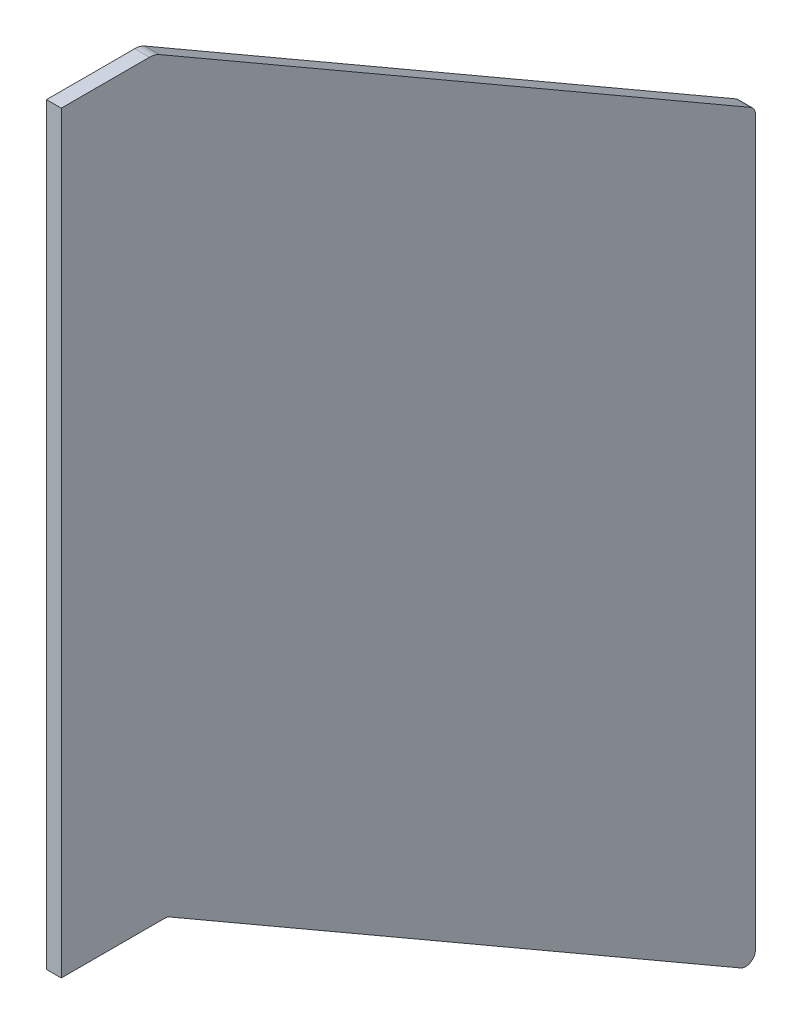
ISO-10303-21;
HEADER;
FILE_DESCRIPTION(('STEP AP214'),'2;1');
FILE_NAME('part.step','',(''),(''),'','','');
FILE_SCHEMA(('AUTOMOTIVE_DESIGN { 1 0 10303 214 1 1 1 1 }'));
ENDSEC;
DATA;
#1=APPLICATION_CONTEXT('core data for automotive mechanical design processes');
#2=APPLICATION_PROTOCOL_DEFINITION('international standard','automotive_design',2000,#1);
#3=PRODUCT_CONTEXT('',#1,'mechanical');
#4=PRODUCT('Part','Part','',(#3));
#5=PRODUCT_RELATED_PRODUCT_CATEGORY('part','',(#4));
#6=PRODUCT_DEFINITION_FORMATION('','',#4);
#7=PRODUCT_DEFINITION_CONTEXT('part definition',#1,'design');
#8=PRODUCT_DEFINITION('design','',#6,#7);
#9=PRODUCT_DEFINITION_SHAPE('','',#8);
#10=(LENGTH_UNIT() NAMED_UNIT(*) SI_UNIT(.MILLI.,.METRE.));
#11=(NAMED_UNIT(*) PLANE_ANGLE_UNIT() SI_UNIT($,.RADIAN.));
#12=(NAMED_UNIT(*) SI_UNIT($,.STERADIAN.) SOLID_ANGLE_UNIT());
#13=UNCERTAINTY_MEASURE_WITH_UNIT(LENGTH_MEASURE(1.E-05),#10,'distance_accuracy_value','');
#14=(GEOMETRIC_REPRESENTATION_CONTEXT(3) GLOBAL_UNCERTAINTY_ASSIGNED_CONTEXT((#13)) GLOBAL_UNIT_ASSIGNED_CONTEXT((#10,
#11,#12)) REPRESENTATION_CONTEXT('',''));
#15=CARTESIAN_POINT('',(0.,0.,0.));
#16=DIRECTION('',(0.,0.,1.));
#17=DIRECTION('',(1.,0.,0.));
#18=AXIS2_PLACEMENT_3D('',#15,#16,#17);
#19=CARTESIAN_POINT('',(-1.5,76.5,0.));
#20=DIRECTION('',(0.,0.,1.));
#21=DIRECTION('',(0.,-1.,0.));
#22=AXIS2_PLACEMENT_3D('',#19,#20,#21);
#23=PLANE('',#22);
#24=DIRECTION('',(0.,-1.,0.));
#25=VECTOR('',#24,1.);
#26=CARTESIAN_POINT('',(0.,76.5,0.));
#27=LINE('',#26,#25);
#28=CARTESIAN_POINT('',(0.,76.5,0.));
#29=VERTEX_POINT('',#28);
#30=CARTESIAN_POINT('',(0.,0.,0.));
#31=VERTEX_POINT('',#30);
#32=EDGE_CURVE('E147',#29,#31,#27,.T.);
#33=ORIENTED_EDGE('',*,*,#32,.F.);
#34=DIRECTION('',(1.,0.,0.));
#35=VECTOR('',#34,1.);
#36=CARTESIAN_POINT('',(-1.5,76.5,0.));
#37=LINE('',#36,#35);
#38=CARTESIAN_POINT('',(-1.5,76.5,0.));
#39=VERTEX_POINT('',#38);
#40=EDGE_CURVE('E11',#39,#29,#37,.T.);
#41=ORIENTED_EDGE('',*,*,#40,.F.);
#42=DIRECTION('',(0.,-1.,0.));
#43=VECTOR('',#42,1.);
#44=CARTESIAN_POINT('',(-1.5,76.5,0.));
#45=LINE('',#44,#43);
#46=CARTESIAN_POINT('',(-1.5,0.,0.));
#47=VERTEX_POINT('',#46);
#48=EDGE_CURVE('E173',#39,#47,#45,.T.);
#49=ORIENTED_EDGE('',*,*,#48,.T.);
#50=DIRECTION('',(1.,0.,0.));
#51=VECTOR('',#50,1.);
#52=CARTESIAN_POINT('',(-1.5,0.,0.));
#53=LINE('',#52,#51);
#54=EDGE_CURVE('E41',#47,#31,#53,.T.);
#55=ORIENTED_EDGE('',*,*,#54,.T.);
#56=EDGE_LOOP('',(#33,#41,#49,#55));
#57=FACE_BOUND('',#56,.T.);
#58=ADVANCED_FACE('F38',(#57),#23,.T.);
#59=CARTESIAN_POINT('',(-1.5,76.5,-8.96410161513773));
#60=DIRECTION('',(0.,1.,0.));
#61=DIRECTION('',(0.,0.,1.));
#62=AXIS2_PLACEMENT_3D('',#59,#60,#61);
#63=PLANE('',#62);
#64=DIRECTION('',(0.,0.,1.));
#65=VECTOR('',#64,1.);
#66=CARTESIAN_POINT('',(0.,76.5,-8.96410161513773));
#67=LINE('',#66,#65);
#68=CARTESIAN_POINT('',(0.,76.5,-8.96410161513773));
#69=VERTEX_POINT('',#68);
#70=EDGE_CURVE('E171',#69,#29,#67,.T.);
#71=ORIENTED_EDGE('',*,*,#70,.F.);
#72=DIRECTION('',(1.,0.,0.));
#73=VECTOR('',#72,1.);
#74=CARTESIAN_POINT('',(-1.5,76.5,-8.96410161513773));
#75=LINE('',#74,#73);
#76=CARTESIAN_POINT('',(-1.5,76.5,-8.96410161513773));
#77=VERTEX_POINT('',#76);
#78=EDGE_CURVE('E47',#77,#69,#75,.T.);
#79=ORIENTED_EDGE('',*,*,#78,.F.);
#80=DIRECTION('',(0.,0.,1.));
#81=VECTOR('',#80,1.);
#82=CARTESIAN_POINT('',(-1.5,76.5,-8.96410161513773));
#83=LINE('',#82,#81);
#84=EDGE_CURVE('E137',#77,#39,#83,.T.);
#85=ORIENTED_EDGE('',*,*,#84,.T.);
#86=ORIENTED_EDGE('',*,*,#40,.T.);
#87=EDGE_LOOP('',(#71,#79,#85,#86));
#88=FACE_BOUND('',#87,.T.);
#89=ADVANCED_FACE('F189',(#88),#63,.T.);
#90=CARTESIAN_POINT('',(-1.5,74.5,-8.96410161513773));
#91=DIRECTION('',(1.,0.,0.));
#92=DIRECTION('',(0.,0.,-1.));
#93=AXIS2_PLACEMENT_3D('',#90,#91,#92);
#94=CYLINDRICAL_SURFACE('',#93,2.00000000000001);
#95=CARTESIAN_POINT('',(0.,74.5,-8.96410161513773));
#96=DIRECTION('',(1.,0.,0.));
#97=DIRECTION('',(0.,0.,-1.));
#98=AXIS2_PLACEMENT_3D('',#95,#96,#97);
#99=CIRCLE('',#98,2.00000000000001);
#100=CARTESIAN_POINT('',(0.,76.2320508075689,-9.96410161513773));
#101=VERTEX_POINT('',#100);
#102=EDGE_CURVE('E124',#101,#69,#99,.T.);
#103=ORIENTED_EDGE('',*,*,#102,.F.);
#104=DIRECTION('',(1.,0.,0.));
#105=VECTOR('',#104,1.);
#106=CARTESIAN_POINT('',(-1.5,76.2320508075689,-9.96410161513773));
#107=LINE('',#106,#105);
#108=CARTESIAN_POINT('',(-1.5,76.2320508075689,-9.96410161513773));
#109=VERTEX_POINT('',#108);
#110=EDGE_CURVE('E119',#109,#101,#107,.T.);
#111=ORIENTED_EDGE('',*,*,#110,.F.);
#112=CARTESIAN_POINT('',(-1.5,74.5,-8.96410161513773));
#113=DIRECTION('',(1.,0.,0.));
#114=DIRECTION('',(0.,0.,-1.));
#115=AXIS2_PLACEMENT_3D('',#112,#113,#114);
#116=CIRCLE('',#115,2.00000000000001);
#117=EDGE_CURVE('E122',#109,#77,#116,.T.);
#118=ORIENTED_EDGE('',*,*,#117,.T.);
#119=ORIENTED_EDGE('',*,*,#78,.T.);
#120=EDGE_LOOP('',(#103,#111,#118,#119));
#121=FACE_BOUND('',#120,.T.);
#122=ADVANCED_FACE('F121',(#121),#94,.T.);
#123=CARTESIAN_POINT('',(-1.5,41.5703087140275,-70.));
#124=DIRECTION('',(0.,0.866025403784438,-0.500000000000001));
#125=DIRECTION('',(0.,0.500000000000001,0.866025403784438));
#126=AXIS2_PLACEMENT_3D('',#123,#124,#125);
#127=PLANE('',#126);
#128=DIRECTION('',(0.,0.500000000000001,0.866025403784438));
#129=VECTOR('',#128,1.);
#130=CARTESIAN_POINT('',(0.,41.5703087140275,-70.));
#131=LINE('',#130,#129);
#132=CARTESIAN_POINT('',(0.,41.5703087140275,-70.));
#133=VERTEX_POINT('',#132);
#134=EDGE_CURVE('E168',#133,#101,#131,.T.);
#135=ORIENTED_EDGE('',*,*,#134,.F.);
#136=DIRECTION('',(1.,0.,0.));
#137=VECTOR('',#136,1.);
#138=CARTESIAN_POINT('',(-1.5,41.5703087140275,-70.));
#139=LINE('',#138,#137);
#140=CARTESIAN_POINT('',(-1.5,41.5703087140275,-70.));
#141=VERTEX_POINT('',#140);
#142=EDGE_CURVE('E129',#141,#133,#139,.T.);
#143=ORIENTED_EDGE('',*,*,#142,.F.);
#144=DIRECTION('',(0.,0.500000000000001,0.866025403784438));
#145=VECTOR('',#144,1.);
#146=CARTESIAN_POINT('',(-1.5,41.5703087140275,-70.));
#147=LINE('',#146,#145);
#148=EDGE_CURVE('E135',#141,#109,#147,.T.);
#149=ORIENTED_EDGE('',*,*,#148,.T.);
#150=ORIENTED_EDGE('',*,*,#110,.T.);
#151=EDGE_LOOP('',(#135,#143,#149,#150));
#152=FACE_BOUND('',#151,.T.);
#153=ADVANCED_FACE('F139',(#152),#127,.T.);
#154=CARTESIAN_POINT('',(-1.5,40.7042833102431,-69.5));
#155=DIRECTION('',(1.,0.,0.));
#156=DIRECTION('',(0.,0.,-1.));
#157=AXIS2_PLACEMENT_3D('',#154,#155,#156);
#158=CYLINDRICAL_SURFACE('',#157,1.00000000000001);
#159=CARTESIAN_POINT('',(0.,40.7042833102431,-69.5));
#160=DIRECTION('',(1.,0.,0.));
#161=DIRECTION('',(0.,0.,-1.));
#162=AXIS2_PLACEMENT_3D('',#159,#160,#161);
#163=CIRCLE('',#162,1.00000000000001);
#164=CARTESIAN_POINT('',(0.,40.7042833102431,-70.5));
#165=VERTEX_POINT('',#164);
#166=EDGE_CURVE('E165',#165,#133,#163,.T.);
#167=ORIENTED_EDGE('',*,*,#166,.F.);
#168=DIRECTION('',(1.,0.,0.));
#169=VECTOR('',#168,1.);
#170=CARTESIAN_POINT('',(-1.5,40.7042833102431,-70.5));
#171=LINE('',#170,#169);
#172=CARTESIAN_POINT('',(-1.5,40.7042833102431,-70.5));
#173=VERTEX_POINT('',#172);
#174=EDGE_CURVE('E177',#173,#165,#171,.T.);
#175=ORIENTED_EDGE('',*,*,#174,.F.);
#176=CARTESIAN_POINT('',(-1.5,40.7042833102431,-69.5));
#177=DIRECTION('',(1.,0.,0.));
#178=DIRECTION('',(0.,0.,-1.));
#179=AXIS2_PLACEMENT_3D('',#176,#177,#178);
#180=CIRCLE('',#179,1.00000000000001);
#181=EDGE_CURVE('E140',#173,#141,#180,.T.);
#182=ORIENTED_EDGE('',*,*,#181,.T.);
#183=ORIENTED_EDGE('',*,*,#142,.T.);
#184=EDGE_LOOP('',(#167,#175,#182,#183));
#185=FACE_BOUND('',#184,.T.);
#186=ADVANCED_FACE('F202',(#185),#158,.T.);
#187=CARTESIAN_POINT('',(-1.5,-32.7542648054295,-70.5));
#188=DIRECTION('',(0.,0.,-1.));
#189=DIRECTION('',(-1.,0.,0.));
#190=AXIS2_PLACEMENT_3D('',#187,#188,#189);
#191=PLANE('',#190);
#192=DIRECTION('',(0.,1.,0.));
#193=VECTOR('',#192,1.);
#194=CARTESIAN_POINT('',(0.,-32.7542648054295,-70.5));
#195=LINE('',#194,#193);
#196=CARTESIAN_POINT('',(0.,-32.7542648054295,-70.5));
#197=VERTEX_POINT('',#196);
#198=EDGE_CURVE('E162',#197,#165,#195,.T.);
#199=ORIENTED_EDGE('',*,*,#198,.F.);
#200=DIRECTION('',(1.,0.,0.));
#201=VECTOR('',#200,1.);
#202=CARTESIAN_POINT('',(-1.5,-32.7542648054295,-70.5));
#203=LINE('',#202,#201);
#204=CARTESIAN_POINT('',(-1.5,-32.7542648054295,-70.5));
#205=VERTEX_POINT('',#204);
#206=EDGE_CURVE('E179',#205,#197,#203,.T.);
#207=ORIENTED_EDGE('',*,*,#206,.F.);
#208=DIRECTION('',(0.,1.,0.));
#209=VECTOR('',#208,1.);
#210=CARTESIAN_POINT('',(-1.5,-32.7542648054295,-70.5));
#211=LINE('',#210,#209);
#212=EDGE_CURVE('E142',#205,#173,#211,.T.);
#213=ORIENTED_EDGE('',*,*,#212,.T.);
#214=ORIENTED_EDGE('',*,*,#174,.T.);
#215=EDGE_LOOP('',(#199,#207,#213,#214));
#216=FACE_BOUND('',#215,.T.);
#217=ADVANCED_FACE('F205',(#216),#191,.T.);
#218=CARTESIAN_POINT('',(-1.5,-32.7542648054295,-69.5));
#219=DIRECTION('',(1.,0.,0.));
#220=DIRECTION('',(0.,0.,-1.));
#221=AXIS2_PLACEMENT_3D('',#218,#219,#220);
#222=CYLINDRICAL_SURFACE('',#221,1.);
#223=CARTESIAN_POINT('',(0.,-32.7542648054295,-69.5));
#224=DIRECTION('',(1.,0.,0.));
#225=DIRECTION('',(0.,0.,-1.));
#226=AXIS2_PLACEMENT_3D('',#223,#224,#225);
#227=CIRCLE('',#226,1.);
#228=CARTESIAN_POINT('',(0.,-33.6202902092139,-69.));
#229=VERTEX_POINT('',#228);
#230=EDGE_CURVE('E159',#229,#197,#227,.T.);
#231=ORIENTED_EDGE('',*,*,#230,.F.);
#232=DIRECTION('',(1.,0.,0.));
#233=VECTOR('',#232,1.);
#234=CARTESIAN_POINT('',(-1.5,-33.6202902092139,-69.));
#235=LINE('',#234,#233);
#236=CARTESIAN_POINT('',(-1.5,-33.6202902092139,-69.));
#237=VERTEX_POINT('',#236);
#238=EDGE_CURVE('E181',#237,#229,#235,.T.);
#239=ORIENTED_EDGE('',*,*,#238,.F.);
#240=CARTESIAN_POINT('',(-1.5,-32.7542648054295,-69.5));
#241=DIRECTION('',(1.,0.,0.));
#242=DIRECTION('',(0.,0.,-1.));
#243=AXIS2_PLACEMENT_3D('',#240,#241,#242);
#244=CIRCLE('',#243,1.);
#245=EDGE_CURVE('E328',#237,#205,#244,.T.);
#246=ORIENTED_EDGE('',*,*,#245,.T.);
#247=ORIENTED_EDGE('',*,*,#206,.T.);
#248=EDGE_LOOP('',(#231,#239,#246,#247));
#249=FACE_BOUND('',#248,.T.);
#250=ADVANCED_FACE('F209',(#249),#222,.T.);
#251=CARTESIAN_POINT('',(-1.5,-0.133974596215561,-11.));
#252=DIRECTION('',(0.,-0.866025403784438,0.500000000000001));
#253=DIRECTION('',(0.,-0.500000000000001,-0.866025403784438));
#254=AXIS2_PLACEMENT_3D('',#251,#252,#253);
#255=PLANE('',#254);
#256=DIRECTION('',(0.,-0.500000000000001,-0.866025403784438));
#257=VECTOR('',#256,1.);
#258=CARTESIAN_POINT('',(0.,-0.133974596215561,-11.));
#259=LINE('',#258,#257);
#260=CARTESIAN_POINT('',(0.,-0.133974596215562,-11.));
#261=VERTEX_POINT('',#260);
#262=EDGE_CURVE('E156',#261,#229,#259,.T.);
#263=ORIENTED_EDGE('',*,*,#262,.F.);
#264=DIRECTION('',(1.,0.,0.));
#265=VECTOR('',#264,1.);
#266=CARTESIAN_POINT('',(-1.5,-0.133974596215562,-11.));
#267=LINE('',#266,#265);
#268=CARTESIAN_POINT('',(-1.5,-0.133974596215562,-11.));
#269=VERTEX_POINT('',#268);
#270=EDGE_CURVE('E183',#269,#261,#267,.T.);
#271=ORIENTED_EDGE('',*,*,#270,.F.);
#272=DIRECTION('',(0.,-0.500000000000001,-0.866025403784438));
#273=VECTOR('',#272,1.);
#274=CARTESIAN_POINT('',(-1.5,-0.133974596215561,-11.));
#275=LINE('',#274,#273);
#276=EDGE_CURVE('E324',#269,#237,#275,.T.);
#277=ORIENTED_EDGE('',*,*,#276,.T.);
#278=ORIENTED_EDGE('',*,*,#238,.T.);
#279=EDGE_LOOP('',(#263,#271,#277,#278));
#280=FACE_BOUND('',#279,.T.);
#281=ADVANCED_FACE('F213',(#280),#255,.T.);
#282=CARTESIAN_POINT('',(-1.5,-1.,-10.5));
#283=DIRECTION('',(1.,0.,0.));
#284=DIRECTION('',(0.,0.,-1.));
#285=AXIS2_PLACEMENT_3D('',#282,#283,#284);
#286=CYLINDRICAL_SURFACE('',#285,1.);
#287=CARTESIAN_POINT('',(0.,-1.,-10.5));
#288=DIRECTION('',(-1.,0.,0.));
#289=DIRECTION('',(0.,0.,-1.));
#290=AXIS2_PLACEMENT_3D('',#287,#288,#289);
#291=CIRCLE('',#290,1.);
#292=CARTESIAN_POINT('',(0.,0.,-10.5));
#293=VERTEX_POINT('',#292);
#294=EDGE_CURVE('E153',#293,#261,#291,.T.);
#295=ORIENTED_EDGE('',*,*,#294,.F.);
#296=DIRECTION('',(1.,0.,0.));
#297=VECTOR('',#296,1.);
#298=CARTESIAN_POINT('',(-1.5,0.,-10.5));
#299=LINE('',#298,#297);
#300=CARTESIAN_POINT('',(-1.5,0.,-10.5));
#301=VERTEX_POINT('',#300);
#302=EDGE_CURVE('E184',#301,#293,#299,.T.);
#303=ORIENTED_EDGE('',*,*,#302,.F.);
#304=CARTESIAN_POINT('',(-1.5,-1.,-10.5));
#305=DIRECTION('',(-1.,0.,0.));
#306=DIRECTION('',(0.,0.,-1.));
#307=AXIS2_PLACEMENT_3D('',#304,#305,#306);
#308=CIRCLE('',#307,1.);
#309=EDGE_CURVE('E335',#301,#269,#308,.T.);
#310=ORIENTED_EDGE('',*,*,#309,.T.);
#311=ORIENTED_EDGE('',*,*,#270,.T.);
#312=EDGE_LOOP('',(#295,#303,#310,#311));
#313=FACE_BOUND('',#312,.T.);
#314=ADVANCED_FACE('F217',(#313),#286,.F.);
#315=CARTESIAN_POINT('',(-1.5,0.,0.));
#316=DIRECTION('',(0.,-1.,0.));
#317=DIRECTION('',(0.,0.,-1.));
#318=AXIS2_PLACEMENT_3D('',#315,#316,#317);
#319=PLANE('',#318);
#320=DIRECTION('',(0.,0.,-1.));
#321=VECTOR('',#320,1.);
#322=CARTESIAN_POINT('',(0.,0.,0.));
#323=LINE('',#322,#321);
#324=EDGE_CURVE('E150',#31,#293,#323,.T.);
#325=ORIENTED_EDGE('',*,*,#324,.F.);
#326=ORIENTED_EDGE('',*,*,#54,.F.);
#327=DIRECTION('',(0.,0.,-1.));
#328=VECTOR('',#327,1.);
#329=CARTESIAN_POINT('',(-1.5,0.,0.));
#330=LINE('',#329,#328);
#331=EDGE_CURVE('E337',#47,#301,#330,.T.);
#332=ORIENTED_EDGE('',*,*,#331,.T.);
#333=ORIENTED_EDGE('',*,*,#302,.T.);
#334=EDGE_LOOP('',(#325,#326,#332,#333));
#335=FACE_BOUND('',#334,.T.);
#336=ADVANCED_FACE('F186',(#335),#319,.T.);
#337=CARTESIAN_POINT('',(-1.5,-1.,-10.5));
#338=DIRECTION('',(1.,0.,0.));
#339=DIRECTION('',(0.,0.,-1.));
#340=AXIS2_PLACEMENT_3D('',#337,#338,#339);
#341=PLANE('',#340);
#342=ORIENTED_EDGE('',*,*,#48,.F.);
#343=ORIENTED_EDGE('',*,*,#84,.F.);
#344=ORIENTED_EDGE('',*,*,#117,.F.);
#345=ORIENTED_EDGE('',*,*,#148,.F.);
#346=ORIENTED_EDGE('',*,*,#181,.F.);
#347=ORIENTED_EDGE('',*,*,#212,.F.);
#348=ORIENTED_EDGE('',*,*,#245,.F.);
#349=ORIENTED_EDGE('',*,*,#276,.F.);
#350=ORIENTED_EDGE('',*,*,#309,.F.);
#351=ORIENTED_EDGE('',*,*,#331,.F.);
#352=EDGE_LOOP('',(#342,#343,#344,#345,#346,#347,#348,#349,#350,#351));
#353=FACE_BOUND('',#352,.T.);
#354=ADVANCED_FACE('F133',(#353),#341,.F.);
#355=CARTESIAN_POINT('',(0.,-1.,-10.5));
#356=DIRECTION('',(1.,0.,0.));
#357=DIRECTION('',(0.,0.,-1.));
#358=AXIS2_PLACEMENT_3D('',#355,#356,#357);
#359=PLANE('',#358);
#360=ORIENTED_EDGE('',*,*,#32,.T.);
#361=ORIENTED_EDGE('',*,*,#324,.T.);
#362=ORIENTED_EDGE('',*,*,#294,.T.);
#363=ORIENTED_EDGE('',*,*,#262,.T.);
#364=ORIENTED_EDGE('',*,*,#230,.T.);
#365=ORIENTED_EDGE('',*,*,#198,.T.);
#366=ORIENTED_EDGE('',*,*,#166,.T.);
#367=ORIENTED_EDGE('',*,*,#134,.T.);
#368=ORIENTED_EDGE('',*,*,#102,.T.);
#369=ORIENTED_EDGE('',*,*,#70,.T.);
#370=EDGE_LOOP('',(#360,#361,#362,#363,#364,#365,#366,#367,#368,#369));
#371=FACE_BOUND('',#370,.T.);
#372=ADVANCED_FACE('F188',(#371),#359,.T.);
#373=CLOSED_SHELL('',(#58,#89,#122,#153,#186,#217,#250,#281,#314,#336,#354,#372));
#374=MANIFOLD_SOLID_BREP('B2',#373);
#375=ADVANCED_BREP_SHAPE_REPRESENTATION('',(#18,#374),#14);
#376=SHAPE_DEFINITION_REPRESENTATION(#9,#375);
ENDSEC;
END-ISO-10303-21;
